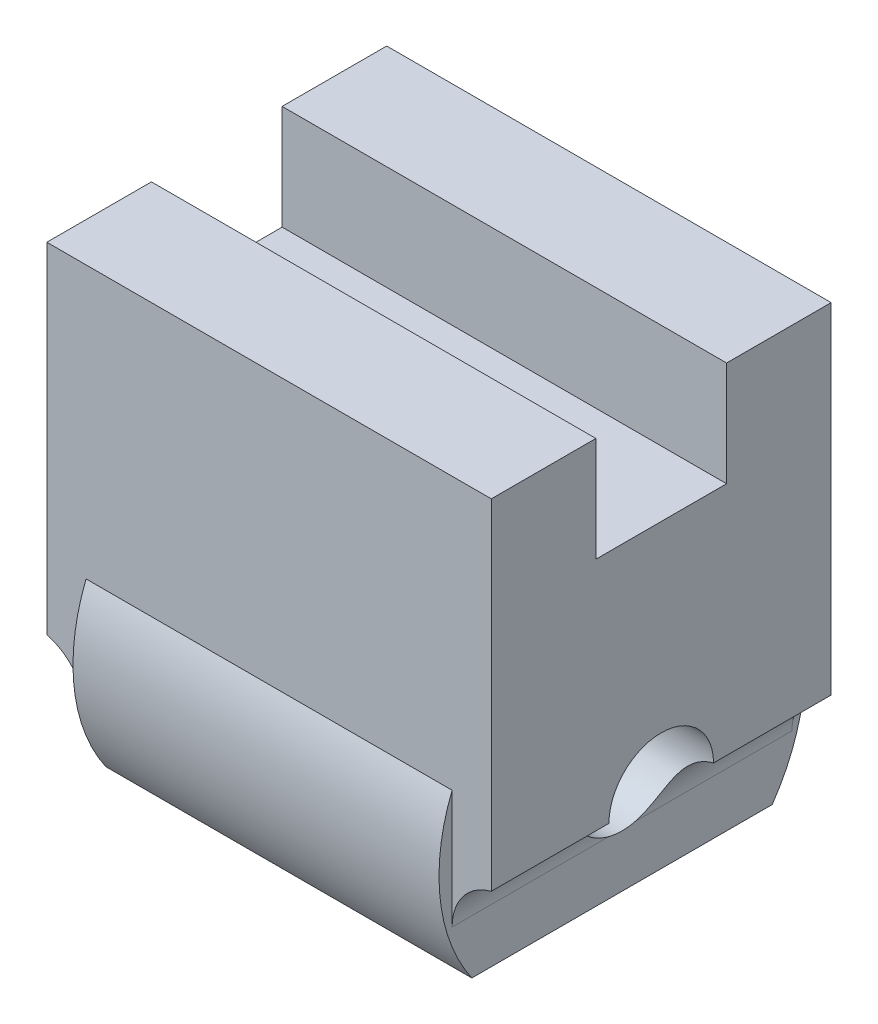
ISO-10303-21;
HEADER;
FILE_DESCRIPTION(('STEP AP214'),'2;1');
FILE_NAME('part.step','',(''),(''),'','','');
FILE_SCHEMA(('AUTOMOTIVE_DESIGN { 1 0 10303 214 1 1 1 1 }'));
ENDSEC;
DATA;
#1=APPLICATION_CONTEXT('core data for automotive mechanical design processes');
#2=APPLICATION_PROTOCOL_DEFINITION('international standard','automotive_design',2000,#1);
#3=PRODUCT_CONTEXT('',#1,'mechanical');
#4=PRODUCT('Part','Part','',(#3));
#5=PRODUCT_RELATED_PRODUCT_CATEGORY('part','',(#4));
#6=PRODUCT_DEFINITION_FORMATION('','',#4);
#7=PRODUCT_DEFINITION_CONTEXT('part definition',#1,'design');
#8=PRODUCT_DEFINITION('design','',#6,#7);
#9=PRODUCT_DEFINITION_SHAPE('','',#8);
#10=(LENGTH_UNIT() NAMED_UNIT(*) SI_UNIT(.MILLI.,.METRE.));
#11=(NAMED_UNIT(*) PLANE_ANGLE_UNIT() SI_UNIT($,.RADIAN.));
#12=(NAMED_UNIT(*) SI_UNIT($,.STERADIAN.) SOLID_ANGLE_UNIT());
#13=UNCERTAINTY_MEASURE_WITH_UNIT(LENGTH_MEASURE(1.E-05),#10,'distance_accuracy_value','');
#14=(GEOMETRIC_REPRESENTATION_CONTEXT(3) GLOBAL_UNCERTAINTY_ASSIGNED_CONTEXT((#13)) GLOBAL_UNIT_ASSIGNED_CONTEXT((#10,
#11,#12)) REPRESENTATION_CONTEXT('',''));
#15=CARTESIAN_POINT('',(0.,0.,0.));
#16=DIRECTION('',(0.,0.,1.));
#17=DIRECTION('',(1.,0.,0.));
#18=AXIS2_PLACEMENT_3D('',#15,#16,#17);
#19=CARTESIAN_POINT('',(70.,70.,0.));
#20=DIRECTION('',(-1.,0.,0.));
#21=DIRECTION('',(0.,0.,1.));
#22=AXIS2_PLACEMENT_3D('',#19,#20,#21);
#23=CYLINDRICAL_SURFACE('',#22,70.);
#24=CARTESIAN_POINT('',(70.,70.,0.));
#25=DIRECTION('',(1.,0.,0.));
#26=DIRECTION('',(0.,0.,-1.));
#27=AXIS2_PLACEMENT_3D('',#24,#25,#26);
#28=CIRCLE('',#27,70.);
#29=CARTESIAN_POINT('',(70.,30.,-57.4456264653803));
#30=VERTEX_POINT('',#29);
#31=CARTESIAN_POINT('',(70.,95.9807621135332,-65.));
#32=VERTEX_POINT('',#31);
#33=EDGE_CURVE('E174',#30,#32,#28,.T.);
#34=ORIENTED_EDGE('',*,*,#33,.F.);
#35=DIRECTION('',(-1.,0.,0.));
#36=VECTOR('',#35,1.);
#37=CARTESIAN_POINT('',(70.,30.,-57.4456264653803));
#38=LINE('',#37,#36);
#39=CARTESIAN_POINT('',(-70.,30.,-57.4456264653803));
#40=VERTEX_POINT('',#39);
#41=EDGE_CURVE('E11',#30,#40,#38,.T.);
#42=ORIENTED_EDGE('',*,*,#41,.T.);
#43=CARTESIAN_POINT('',(-70.,70.,0.));
#44=DIRECTION('',(1.,0.,0.));
#45=DIRECTION('',(0.,0.,-1.));
#46=AXIS2_PLACEMENT_3D('',#43,#44,#45);
#47=CIRCLE('',#46,70.);
#48=CARTESIAN_POINT('',(-70.,95.9807621135332,-65.));
#49=VERTEX_POINT('',#48);
#50=EDGE_CURVE('E170',#40,#49,#47,.T.);
#51=ORIENTED_EDGE('',*,*,#50,.T.);
#52=DIRECTION('',(-1.,0.,0.));
#53=VECTOR('',#52,1.);
#54=CARTESIAN_POINT('',(70.,95.9807621135332,-65.));
#55=LINE('',#54,#53);
#56=EDGE_CURVE('E182',#49,#32,#55,.F.);
#57=ORIENTED_EDGE('',*,*,#56,.T.);
#58=EDGE_LOOP('',(#34,#42,#51,#57));
#59=FACE_BOUND('',#58,.T.);
#60=ADVANCED_FACE('F32',(#59),#23,.T.);
#61=CARTESIAN_POINT('',(1.3992221045877E-12,200.,0.));
#62=DIRECTION('',(0.,-1.,0.));
#63=DIRECTION('',(1.,0.,0.));
#64=AXIS2_PLACEMENT_3D('',#61,#62,#63);
#65=PLANE('',#64);
#66=DIRECTION('',(0.,0.,-1.));
#67=VECTOR('',#66,1.);
#68=CARTESIAN_POINT('',(-84.9999999999986,200.000000000001,65.));
#69=LINE('',#68,#67);
#70=CARTESIAN_POINT('',(-84.9999999999995,200.000000000001,-25.));
#71=VERTEX_POINT('',#70);
#72=CARTESIAN_POINT('',(-84.9999999999986,200.000000000001,-65.));
#73=VERTEX_POINT('',#72);
#74=EDGE_CURVE('E383',#71,#73,#69,.T.);
#75=ORIENTED_EDGE('',*,*,#74,.F.);
#76=DIRECTION('',(1.,0.,0.));
#77=VECTOR('',#76,1.);
#78=CARTESIAN_POINT('',(1.3992221045877E-12,200.,-25.));
#79=LINE('',#78,#77);
#80=CARTESIAN_POINT('',(85.0000000000014,199.999999999999,-25.));
#81=VERTEX_POINT('',#80);
#82=EDGE_CURVE('E188',#71,#81,#79,.T.);
#83=ORIENTED_EDGE('',*,*,#82,.T.);
#84=DIRECTION('',(0.,0.,1.));
#85=VECTOR('',#84,1.);
#86=CARTESIAN_POINT('',(85.0000000000014,199.999999999999,65.));
#87=LINE('',#86,#85);
#88=CARTESIAN_POINT('',(85.0000000000014,199.999999999999,-65.));
#89=VERTEX_POINT('',#88);
#90=EDGE_CURVE('E379',#89,#81,#87,.T.);
#91=ORIENTED_EDGE('',*,*,#90,.F.);
#92=DIRECTION('',(1.,0.,0.));
#93=VECTOR('',#92,1.);
#94=CARTESIAN_POINT('',(-84.9999999999986,200.000000000001,-65.));
#95=LINE('',#94,#93);
#96=EDGE_CURVE('E326',#73,#89,#95,.T.);
#97=ORIENTED_EDGE('',*,*,#96,.F.);
#98=EDGE_LOOP('',(#75,#83,#91,#97));
#99=FACE_BOUND('',#98,.T.);
#100=ADVANCED_FACE('F258',(#99),#65,.F.);
#101=CARTESIAN_POINT('',(70.,70.,0.));
#102=DIRECTION('',(1.,0.,0.));
#103=DIRECTION('',(0.,0.,-1.));
#104=AXIS2_PLACEMENT_3D('',#101,#102,#103);
#105=PLANE('',#104);
#106=DIRECTION('',(0.,0.,1.));
#107=VECTOR('',#106,1.);
#108=CARTESIAN_POINT('',(70.,30.,0.));
#109=LINE('',#108,#107);
#110=CARTESIAN_POINT('',(70.,30.,57.4456264653803));
#111=VERTEX_POINT('',#110);
#112=EDGE_CURVE('E48',#30,#111,#109,.T.);
#113=ORIENTED_EDGE('',*,*,#112,.F.);
#114=ORIENTED_EDGE('',*,*,#33,.T.);
#115=DIRECTION('',(0.,1.,0.));
#116=VECTOR('',#115,1.);
#117=CARTESIAN_POINT('',(70.,70.,-65.));
#118=LINE('',#117,#116);
#119=CARTESIAN_POINT('',(70.,50.6350832689622,-65.));
#120=VERTEX_POINT('',#119);
#121=EDGE_CURVE('E283',#120,#32,#118,.T.);
#122=ORIENTED_EDGE('',*,*,#121,.F.);
#123=DIRECTION('',(0.,0.,-1.));
#124=VECTOR('',#123,1.);
#125=CARTESIAN_POINT('',(70.,50.6350832689622,-20.));
#126=LINE('',#125,#124);
#127=CARTESIAN_POINT('',(70.,50.6350832689622,-4.99999999999721));
#128=VERTEX_POINT('',#127);
#129=EDGE_CURVE('E304',#120,#128,#126,.F.);
#130=ORIENTED_EDGE('',*,*,#129,.T.);
#131=CARTESIAN_POINT('',(70.,70.,0.));
#132=DIRECTION('',(1.,0.,0.));
#133=DIRECTION('',(0.,0.,-1.));
#134=AXIS2_PLACEMENT_3D('',#131,#132,#133);
#135=CIRCLE('',#134,20.);
#136=CARTESIAN_POINT('',(70.,50.6350832689622,4.99999999999721));
#137=VERTEX_POINT('',#136);
#138=EDGE_CURVE('E178',#137,#128,#135,.T.);
#139=ORIENTED_EDGE('',*,*,#138,.F.);
#140=DIRECTION('',(0.,0.,-1.));
#141=VECTOR('',#140,1.);
#142=CARTESIAN_POINT('',(70.,50.6350832689622,65.));
#143=LINE('',#142,#141);
#144=CARTESIAN_POINT('',(70.,50.6350832689622,65.));
#145=VERTEX_POINT('',#144);
#146=EDGE_CURVE('E240',#137,#145,#143,.F.);
#147=ORIENTED_EDGE('',*,*,#146,.T.);
#148=DIRECTION('',(0.,-1.,0.));
#149=VECTOR('',#148,1.);
#150=CARTESIAN_POINT('',(70.,70.,65.));
#151=LINE('',#150,#149);
#152=CARTESIAN_POINT('',(70.,95.9807621135331,65.));
#153=VERTEX_POINT('',#152);
#154=EDGE_CURVE('E56',#153,#145,#151,.T.);
#155=ORIENTED_EDGE('',*,*,#154,.F.);
#156=EDGE_CURVE('E176',#153,#111,#28,.T.);
#157=ORIENTED_EDGE('',*,*,#156,.T.);
#158=EDGE_LOOP('',(#113,#114,#122,#130,#139,#147,#155,#157));
#159=FACE_BOUND('',#158,.T.);
#160=ADVANCED_FACE('F225',(#159),#105,.T.);
#161=CARTESIAN_POINT('',(-70.,70.,0.));
#162=DIRECTION('',(1.,0.,0.));
#163=DIRECTION('',(0.,0.,-1.));
#164=AXIS2_PLACEMENT_3D('',#161,#162,#163);
#165=PLANE('',#164);
#166=ORIENTED_EDGE('',*,*,#50,.F.);
#167=DIRECTION('',(0.,0.,1.));
#168=VECTOR('',#167,1.);
#169=CARTESIAN_POINT('',(-70.,30.,0.));
#170=LINE('',#169,#168);
#171=CARTESIAN_POINT('',(-70.,30.,57.4456264653803));
#172=VERTEX_POINT('',#171);
#173=EDGE_CURVE('E157',#40,#172,#170,.T.);
#174=ORIENTED_EDGE('',*,*,#173,.T.);
#175=CARTESIAN_POINT('',(-70.,95.9807621135331,65.));
#176=VERTEX_POINT('',#175);
#177=EDGE_CURVE('E167',#176,#172,#47,.T.);
#178=ORIENTED_EDGE('',*,*,#177,.F.);
#179=DIRECTION('',(0.,-1.,0.));
#180=VECTOR('',#179,1.);
#181=CARTESIAN_POINT('',(-70.,70.,65.));
#182=LINE('',#181,#180);
#183=CARTESIAN_POINT('',(-70.,50.6350832689636,65.));
#184=VERTEX_POINT('',#183);
#185=EDGE_CURVE('E341',#176,#184,#182,.T.);
#186=ORIENTED_EDGE('',*,*,#185,.T.);
#187=DIRECTION('',(0.,0.,-1.));
#188=VECTOR('',#187,1.);
#189=CARTESIAN_POINT('',(-70.,50.6350832689636,0.));
#190=LINE('',#189,#188);
#191=CARTESIAN_POINT('',(-70.,50.6350832689636,5.0000000000028));
#192=VERTEX_POINT('',#191);
#193=EDGE_CURVE('E191',#184,#192,#190,.T.);
#194=ORIENTED_EDGE('',*,*,#193,.T.);
#195=CARTESIAN_POINT('',(-70.,70.,0.));
#196=DIRECTION('',(1.,0.,0.));
#197=DIRECTION('',(0.,0.,-1.));
#198=AXIS2_PLACEMENT_3D('',#195,#196,#197);
#199=CIRCLE('',#198,20.);
#200=CARTESIAN_POINT('',(-70.,50.6350832689636,-5.0000000000028));
#201=VERTEX_POINT('',#200);
#202=EDGE_CURVE('E288',#192,#201,#199,.T.);
#203=ORIENTED_EDGE('',*,*,#202,.T.);
#204=DIRECTION('',(0.,0.,-1.));
#205=VECTOR('',#204,1.);
#206=CARTESIAN_POINT('',(-70.,50.6350832689636,0.));
#207=LINE('',#206,#205);
#208=CARTESIAN_POINT('',(-70.,50.6350832689636,-65.));
#209=VERTEX_POINT('',#208);
#210=EDGE_CURVE('E194',#201,#209,#207,.T.);
#211=ORIENTED_EDGE('',*,*,#210,.T.);
#212=DIRECTION('',(0.,1.,0.));
#213=VECTOR('',#212,1.);
#214=CARTESIAN_POINT('',(-70.,70.,-65.));
#215=LINE('',#214,#213);
#216=EDGE_CURVE('E289',#209,#49,#215,.T.);
#217=ORIENTED_EDGE('',*,*,#216,.T.);
#218=EDGE_LOOP('',(#166,#174,#178,#186,#194,#203,#211,#217));
#219=FACE_BOUND('',#218,.T.);
#220=ADVANCED_FACE('F166',(#219),#165,.F.);
#221=ORIENTED_EDGE('',*,*,#177,.T.);
#222=DIRECTION('',(-1.,0.,0.));
#223=VECTOR('',#222,1.);
#224=CARTESIAN_POINT('',(70.,30.,57.4456264653803));
#225=LINE('',#224,#223);
#226=EDGE_CURVE('E41',#172,#111,#225,.F.);
#227=ORIENTED_EDGE('',*,*,#226,.T.);
#228=ORIENTED_EDGE('',*,*,#156,.F.);
#229=DIRECTION('',(-1.,0.,0.));
#230=VECTOR('',#229,1.);
#231=CARTESIAN_POINT('',(70.,95.9807621135331,65.));
#232=LINE('',#231,#230);
#233=EDGE_CURVE('E173',#153,#176,#232,.T.);
#234=ORIENTED_EDGE('',*,*,#233,.T.);
#235=EDGE_LOOP('',(#221,#227,#228,#234));
#236=FACE_BOUND('',#235,.T.);
#237=ADVANCED_FACE('F172',(#236),#23,.T.);
#238=CARTESIAN_POINT('',(70.,70.,0.));
#239=DIRECTION('',(-1.,0.,0.));
#240=DIRECTION('',(0.,0.,1.));
#241=AXIS2_PLACEMENT_3D('',#238,#239,#240);
#242=CYLINDRICAL_SURFACE('',#241,20.);
#243=CARTESIAN_POINT('',(85.0000000000014,70.,0.));
#244=DIRECTION('',(1.,0.,0.));
#245=DIRECTION('',(0.,0.,-1.));
#246=AXIS2_PLACEMENT_3D('',#243,#244,#245);
#247=CIRCLE('',#246,20.);
#248=CARTESIAN_POINT('',(85.0000000000014,69.9999999999994,-20.));
#249=VERTEX_POINT('',#248);
#250=CARTESIAN_POINT('',(85.0000000000014,69.9999999999994,20.));
#251=VERTEX_POINT('',#250);
#252=EDGE_CURVE('E277',#249,#251,#247,.T.);
#253=ORIENTED_EDGE('',*,*,#252,.T.);
#254=CARTESIAN_POINT('',(85.0000000000014,69.9999999999994,20.));
#255=CARTESIAN_POINT('',(84.7427074592039,69.9335671294805,19.9999941252534));
#256=CARTESIAN_POINT('',(84.4867666335434,69.8620132510583,19.9996696078788));
#257=CARTESIAN_POINT('',(83.9779374257079,69.7087661743903,19.9980274471001));
#258=CARTESIAN_POINT('',(83.7250490956175,69.6270728034024,19.9967097867744));
#259=CARTESIAN_POINT('',(82.9714623482678,69.3669283434809,19.9907330250322));
#260=CARTESIAN_POINT('',(82.4758803123705,69.173422758553,19.9840500385));
#261=CARTESIAN_POINT('',(81.4993489290365,68.7465286444309,19.9618308336082));
#262=CARTESIAN_POINT('',(81.0184900783613,68.5129360333819,19.9462483130445));
#263=CARTESIAN_POINT('',(80.0774660251078,68.0082889903879,19.9021911135866));
#264=CARTESIAN_POINT('',(79.6172989777623,67.7372379068456,19.8737175864989));
#265=CARTESIAN_POINT('',(78.7195029979795,67.1588985733926,19.7993284013292));
#266=CARTESIAN_POINT('',(78.2819573440731,66.8514884714401,19.7533528766909));
#267=CARTESIAN_POINT('',(77.4346109814203,66.2041298660986,19.6392297160765));
#268=CARTESIAN_POINT('',(77.0248112102497,65.864180264086,19.5710813312969));
#269=CARTESIAN_POINT('',(76.2376187549375,65.1566560348378,19.4080749020957));
#270=CARTESIAN_POINT('',(75.8601349964767,64.7891649117772,19.3132953765189));
#271=CARTESIAN_POINT('',(75.1395414964075,64.030615716364,19.0924684475093));
#272=CARTESIAN_POINT('',(74.7964268403537,63.6395610262148,18.966425523422));
#273=CARTESIAN_POINT('',(74.1756360546293,62.8747952871399,18.6917580273858));
#274=CARTESIAN_POINT('',(73.8948626715499,62.5025454159218,18.5460610080773));
#275=CARTESIAN_POINT('',(73.3657431761455,61.7487453449488,18.2231945912555));
#276=CARTESIAN_POINT('',(73.1173951251092,61.3671957028477,18.0460270768603));
#277=CARTESIAN_POINT('',(72.6538479711963,60.6006084014706,17.6588733036046));
#278=CARTESIAN_POINT('',(72.4386495919481,60.2155706662467,17.4488863285255));
#279=CARTESIAN_POINT('',(72.0412033464985,59.4480499452908,16.9957311522824));
#280=CARTESIAN_POINT('',(71.8589533982601,59.0655667996043,16.7525650494383));
#281=CARTESIAN_POINT('',(71.5443117110312,58.3502179838621,16.2619118927584));
#282=CARTESIAN_POINT('',(71.40865294179,58.0164809935816,16.0177724685596));
#283=CARTESIAN_POINT('',(71.1610867512103,57.3595571358377,15.5046084980192));
#284=CARTESIAN_POINT('',(71.0491773131202,57.036369374526,15.2355860674868));
#285=CARTESIAN_POINT('',(70.8471686439326,56.4039059793817,14.6739613503173));
#286=CARTESIAN_POINT('',(70.7570731910547,56.0946327631138,14.3813549905844));
#287=CARTESIAN_POINT('',(70.5964515323665,55.4929922170986,13.7742296372979));
#288=CARTESIAN_POINT('',(70.5259262547055,55.2006256897005,13.4597096053353));
#289=CARTESIAN_POINT('',(70.3988962246105,54.6211904914265,12.7943887496277));
#290=CARTESIAN_POINT('',(70.3432643680769,54.335110355471,12.4425612193168));
#291=CARTESIAN_POINT('',(70.2479012824552,53.7866089425579,11.7188795384661));
#292=CARTESIAN_POINT('',(70.2081712269359,53.5241894128833,11.3470239121298));
#293=CARTESIAN_POINT('',(70.1416844650012,53.024808090428,10.5853820661507));
#294=CARTESIAN_POINT('',(70.1149311364398,52.7878529385296,10.1955912068281));
#295=CARTESIAN_POINT('',(70.0716186272242,52.3409636582875,9.40034123010729));
#296=CARTESIAN_POINT('',(70.055057913984,52.131025471365,8.99488447801873));
#297=CARTESIAN_POINT('',(70.0334006331355,51.798540063703,8.29507635327198));
#298=CARTESIAN_POINT('',(70.0263518584067,51.668759856237,8.00419074375462));
#299=CARTESIAN_POINT('',(70.0151577328729,51.4232311126667,7.41653781772456));
#300=CARTESIAN_POINT('',(70.011011975328,51.307480612749,7.1197713311716));
#301=CARTESIAN_POINT('',(70.0048917123063,51.0905342956625,6.52173583528294));
#302=CARTESIAN_POINT('',(70.0029121425622,50.9893050137183,6.22047900390617));
#303=CARTESIAN_POINT('',(70.0004736473763,50.8012956691385,5.61344696504418));
#304=CARTESIAN_POINT('',(70.0000148893766,50.7145171985427,5.30767126375185));
#305=CARTESIAN_POINT('',(70.,50.6350832689622,4.99999999999721));
#306=B_SPLINE_CURVE_WITH_KNOTS('',3,(#254,#255,#256,#257,#258,#259,#260,#261,#262,#263,#264,
#265,#266,#267,#268,#269,#270,#271,#272,#273,#274,#275,#276,#277,#278,#279,#280,#281,#282,#283,
#284,#285,#286,#287,#288,#289,#290,#291,#292,#293,#294,#295,#296,#297,#298,#299,#300,#301,#302,
#303,#304,#305),.UNSPECIFIED.,.F.,.F.,(4,2,2,2,2,2,2,2,2,2,2,2,2,2,2,2,2,2,2,2,2,2,2,2,2,4),(0.,
0.797081363371371,1.59417630812601,3.18848402512487,4.79116311684559,6.39369903807382,
8.00176650623362,9.60988828636525,11.2133175794024,12.8165172694632,14.2799171292234,
15.7432294521723,17.2065737134291,18.6698254724797,19.9738998315775,21.277863406616,
22.5820526690735,23.8863037743872,25.2554922205815,26.6247816956151,27.9944274069276,
29.3638671246942,30.3193238214475,31.2746466229725,32.2277311997555,33.1809207080943),.UNSPECIFIED.);
#307=EDGE_CURVE('E232',#251,#137,#306,.T.);
#308=ORIENTED_EDGE('',*,*,#307,.T.);
#309=ORIENTED_EDGE('',*,*,#138,.T.);
#310=CARTESIAN_POINT('',(70.,50.6350832689622,-4.99999999999721));
#311=CARTESIAN_POINT('',(70.0000058747466,50.7015161394813,-5.2572925407947));
#312=CARTESIAN_POINT('',(70.0003303921212,50.7730700179035,-5.51323336645523));
#313=CARTESIAN_POINT('',(70.0019725528999,50.9263170945715,-6.0220625742907));
#314=CARTESIAN_POINT('',(70.0032902132256,51.0080104655593,-6.27495090438108));
#315=CARTESIAN_POINT('',(70.0092669749678,51.2681549254808,-7.02853765173086));
#316=CARTESIAN_POINT('',(70.0159499615,51.4616605104087,-7.52411968762812));
#317=CARTESIAN_POINT('',(70.0381691663917,51.8885546245307,-8.50065107096221));
#318=CARTESIAN_POINT('',(70.0537516869555,52.1221472355797,-8.98150992163746));
#319=CARTESIAN_POINT('',(70.0978088864133,52.6267942785736,-9.92253397489101));
#320=CARTESIAN_POINT('',(70.126282413501,52.8978453621158,-10.3827010222365));
#321=CARTESIAN_POINT('',(70.2006715986707,53.4761846955688,-11.2804970020194));
#322=CARTESIAN_POINT('',(70.246647123309,53.7835947975213,-11.7180426559258));
#323=CARTESIAN_POINT('',(70.3607702839233,54.4309534028628,-12.5653890185787));
#324=CARTESIAN_POINT('',(70.4289186687029,54.7709030048754,-12.9751887897493));
#325=CARTESIAN_POINT('',(70.5919250979041,55.4784272341235,-13.7623812450616));
#326=CARTESIAN_POINT('',(70.6867046234808,55.8459183571841,-14.1398650035224));
#327=CARTESIAN_POINT('',(70.9075315524905,56.6044675525973,-14.8604585035917));
#328=CARTESIAN_POINT('',(71.0335744765777,56.9955222427464,-15.2035731596455));
#329=CARTESIAN_POINT('',(71.3082419726139,57.7602879818214,-15.8243639453699));
#330=CARTESIAN_POINT('',(71.4539389919223,58.1325378530395,-16.1051373284494));
#331=CARTESIAN_POINT('',(71.7768054087441,58.8863379240124,-16.6342568238539));
#332=CARTESIAN_POINT('',(71.9539729231393,59.2678875661136,-16.8826048748902));
#333=CARTESIAN_POINT('',(72.3411266963949,60.0344748674907,-17.3461520288032));
#334=CARTESIAN_POINT('',(72.551113671474,60.4195126027146,-17.5613504080514));
#335=CARTESIAN_POINT('',(73.0042688477171,61.1870333236705,-17.9587966535011));
#336=CARTESIAN_POINT('',(73.2474349505611,61.5695164693571,-18.1410466017396));
#337=CARTESIAN_POINT('',(73.738088107241,62.2848652850993,-18.4556882889685));
#338=CARTESIAN_POINT('',(73.9822275314398,62.6186022753798,-18.5913470582097));
#339=CARTESIAN_POINT('',(74.4953915019802,63.2755261331238,-18.8389132487894));
#340=CARTESIAN_POINT('',(74.7644139325125,63.5987138944355,-18.9508226868796));
#341=CARTESIAN_POINT('',(75.3260386496821,64.2311772895798,-19.1528313560672));
#342=CARTESIAN_POINT('',(75.6186450094149,64.5404505058477,-19.2429268089451));
#343=CARTESIAN_POINT('',(76.2257703627014,65.1420910518629,-19.4035484676333));
#344=CARTESIAN_POINT('',(76.540290394664,65.434457579261,-19.4740737452944));
#345=CARTESIAN_POINT('',(77.2056112503715,66.0138927775351,-19.6011037753894));
#346=CARTESIAN_POINT('',(77.5574387806824,66.2999729134906,-19.656735631923));
#347=CARTESIAN_POINT('',(78.281120461533,66.8484743264037,-19.7520987175447));
#348=CARTESIAN_POINT('',(78.6529760878693,67.1108938560783,-19.7918287730641));
#349=CARTESIAN_POINT('',(79.4146179338484,67.6102751785336,-19.8583155349987));
#350=CARTESIAN_POINT('',(79.8044087931709,67.8472303304321,-19.8850688635602));
#351=CARTESIAN_POINT('',(80.5996587698917,68.2941196106741,-19.9283813727758));
#352=CARTESIAN_POINT('',(81.0051155219803,68.5040577975967,-19.9449420860159));
#353=CARTESIAN_POINT('',(81.7049236467269,68.8365432052587,-19.9665993668645));
#354=CARTESIAN_POINT('',(81.9958092562443,68.9663234127247,-19.9736481415933));
#355=CARTESIAN_POINT('',(82.5834621822742,69.211852156295,-19.9848422671271));
#356=CARTESIAN_POINT('',(82.8802286688272,69.3276026562127,-19.988988024672));
#357=CARTESIAN_POINT('',(83.4782641647157,69.5445489732992,-19.9951082876937));
#358=CARTESIAN_POINT('',(83.7795209960925,69.6457782552435,-19.9970878574378));
#359=CARTESIAN_POINT('',(84.3865530349544,69.8337875998233,-19.9995263526237));
#360=CARTESIAN_POINT('',(84.6923287362467,69.9205660704191,-19.9999851106234));
#361=CARTESIAN_POINT('',(85.0000000000013,69.9999999999996,-20.));
#362=B_SPLINE_CURVE_WITH_KNOTS('',3,(#310,#311,#312,#313,#314,#315,#316,#317,#318,#319,#320,
#321,#322,#323,#324,#325,#326,#327,#328,#329,#330,#331,#332,#333,#334,#335,#336,#337,#338,#339,
#340,#341,#342,#343,#344,#345,#346,#347,#348,#349,#350,#351,#352,#353,#354,#355,#356,#357,#358,
#359,#360,#361),.UNSPECIFIED.,.F.,.F.,(4,2,2,2,2,2,2,2,2,2,2,2,2,2,2,2,2,2,2,2,2,2,2,2,2,4),(0.,
0.797081363371389,1.59417630812604,3.18848402512492,4.79116311684566,6.39369903807395,
8.00176650623378,9.60988828636545,11.2133175794026,12.8165172694634,14.2799171292237,
15.7432294521726,17.2065737134295,18.6698254724801,19.973899831578,21.2778634066165,
22.5820526690739,23.8863037743877,25.255492220582,26.6247816956155,27.994427406928,
29.3638671246946,30.3193238214478,31.2746466229727,32.2277311997555,33.1809207080942),.UNSPECIFIED.);
#363=EDGE_CURVE('E162',#128,#249,#362,.T.);
#364=ORIENTED_EDGE('',*,*,#363,.T.);
#365=EDGE_LOOP('',(#253,#308,#309,#364));
#366=FACE_BOUND('',#365,.T.);
#367=ORIENTED_EDGE('',*,*,#202,.F.);
#368=CARTESIAN_POINT('',(-70.,50.6350832689636,5.0000000000028));
#369=CARTESIAN_POINT('',(-70.0000058747466,50.7015161394828,5.25729254080025));
#370=CARTESIAN_POINT('',(-70.0003303921212,50.7730700179051,5.51323336646074));
#371=CARTESIAN_POINT('',(-70.0019725528999,50.9263170945732,6.02206257429613));
#372=CARTESIAN_POINT('',(-70.0032902132256,51.0080104655611,6.27495090438646));
#373=CARTESIAN_POINT('',(-70.0092669749678,51.2681549254827,7.02853765173611));
#374=CARTESIAN_POINT('',(-70.0159499615,51.4616605104108,7.52411968763328));
#375=CARTESIAN_POINT('',(-70.0381691663918,51.888554624533,8.50065107096718));
#376=CARTESIAN_POINT('',(-70.0537516869556,52.1221472355821,8.98150992164232));
#377=CARTESIAN_POINT('',(-70.0978088864134,52.6267942785763,9.92253397489566));
#378=CARTESIAN_POINT('',(-70.1262824135011,52.8978453621186,10.382701022241));
#379=CARTESIAN_POINT('',(-70.2006715986709,53.4761846955718,11.2804970020237));
#380=CARTESIAN_POINT('',(-70.2466471233092,53.7835947975243,11.71804265593));
#381=CARTESIAN_POINT('',(-70.3607702839236,54.430953402866,12.5653890185826));
#382=CARTESIAN_POINT('',(-70.4289186687033,54.7709030048786,12.9751887897531));
#383=CARTESIAN_POINT('',(-70.5919250979046,55.4784272341269,13.7623812450652));
#384=CARTESIAN_POINT('',(-70.6867046234814,55.8459183571875,14.1398650035259));
#385=CARTESIAN_POINT('',(-70.9075315524911,56.6044675526008,14.8604585035949));
#386=CARTESIAN_POINT('',(-71.0335744765784,56.99552224275,15.2035731596486));
#387=CARTESIAN_POINT('',(-71.3082419726147,57.760287981825,15.8243639453728));
#388=CARTESIAN_POINT('',(-71.4539389919232,58.1325378530432,16.1051373284521));
#389=CARTESIAN_POINT('',(-71.776805408745,58.8863379240161,16.6342568238564));
#390=CARTESIAN_POINT('',(-71.9539729231404,59.2678875661172,16.8826048748926));
#391=CARTESIAN_POINT('',(-72.3411266963961,60.0344748674943,17.3461520288053));
#392=CARTESIAN_POINT('',(-72.5511136714752,60.4195126027182,17.5613504080533));
#393=CARTESIAN_POINT('',(-73.0042688477184,61.187033323674,17.9587966535028));
#394=CARTESIAN_POINT('',(-73.2474349505625,61.5695164693606,18.1410466017412));
#395=CARTESIAN_POINT('',(-73.7380881072424,62.2848652851027,18.4556882889699));
#396=CARTESIAN_POINT('',(-73.9822275314413,62.6186022753832,18.591347058211));
#397=CARTESIAN_POINT('',(-74.4953915019817,63.2755261331271,18.8389132487906));
#398=CARTESIAN_POINT('',(-74.7644139325141,63.5987138944388,18.9508226868807));
#399=CARTESIAN_POINT('',(-75.3260386496837,64.231177289583,19.1528313560682));
#400=CARTESIAN_POINT('',(-75.6186450094166,64.5404505058509,19.242926808946));
#401=CARTESIAN_POINT('',(-76.2257703627032,65.142091051866,19.4035484676341));
#402=CARTESIAN_POINT('',(-76.5402903946658,65.4344575792641,19.4740737452951));
#403=CARTESIAN_POINT('',(-77.2056112503734,66.0138927775381,19.60110377539));
#404=CARTESIAN_POINT('',(-77.5574387806843,66.2999729134936,19.6567356319236));
#405=CARTESIAN_POINT('',(-78.2811204615351,66.8484743264067,19.7520987175451));
#406=CARTESIAN_POINT('',(-78.6529760878715,67.1108938560812,19.7918287730645));
#407=CARTESIAN_POINT('',(-79.4146179338507,67.6102751785365,19.8583155349991));
#408=CARTESIAN_POINT('',(-79.8044087931733,67.8472303304349,19.8850688635605));
#409=CARTESIAN_POINT('',(-80.5996587698942,68.2941196106769,19.928381372776));
#410=CARTESIAN_POINT('',(-81.0051155219828,68.5040577975995,19.9449420860161));
#411=CARTESIAN_POINT('',(-81.7049236467292,68.8365432052612,19.9665993668647));
#412=CARTESIAN_POINT('',(-81.9958092562462,68.966323412727,19.9736481415934));
#413=CARTESIAN_POINT('',(-82.5834621822756,69.211852156297,19.9848422671271));
#414=CARTESIAN_POINT('',(-82.8802286688282,69.3276026562145,19.9889880246721));
#415=CARTESIAN_POINT('',(-83.478264164716,69.5445489733008,19.9951082876937));
#416=CARTESIAN_POINT('',(-83.7795209960924,69.6457782552449,19.9970878574378));
#417=CARTESIAN_POINT('',(-84.3865530349536,69.8337875998245,19.9995263526237));
#418=CARTESIAN_POINT('',(-84.6923287362455,69.9205660704202,19.9999851106234));
#419=CARTESIAN_POINT('',(-84.9999999999998,70.0000000000007,20.));
#420=B_SPLINE_CURVE_WITH_KNOTS('',3,(#368,#369,#370,#371,#372,#373,#374,#375,#376,#377,#378,
#379,#380,#381,#382,#383,#384,#385,#386,#387,#388,#389,#390,#391,#392,#393,#394,#395,#396,#397,
#398,#399,#400,#401,#402,#403,#404,#405,#406,#407,#408,#409,#410,#411,#412,#413,#414,#415,#416,
#417,#418,#419),.UNSPECIFIED.,.F.,.F.,(4,2,2,2,2,2,2,2,2,2,2,2,2,2,2,2,2,2,2,2,2,2,2,2,2,4),(0.,
0.797081363371327,1.59417630812592,3.18848402512467,4.79116311684529,6.39369903807346,
8.00176650623316,9.60988828636471,11.2133175794017,12.8165172694625,14.2799171292225,
15.7432294521713,17.2065737134281,18.6698254724785,19.9738998315764,21.2778634066148,
22.5820526690722,23.8863037743859,25.2554922205804,26.624781695614,27.9944274069265,
29.3638671246932,30.3193238214454,31.2746466229691,32.2277311997508,33.1809207080884),.UNSPECIFIED.);
#421=CARTESIAN_POINT('',(-84.9999999999998,70.0000000000006,20.));
#422=VERTEX_POINT('',#421);
#423=EDGE_CURVE('E207',#192,#422,#420,.T.);
#424=ORIENTED_EDGE('',*,*,#423,.T.);
#425=CARTESIAN_POINT('',(-84.9999999999998,70.,0.));
#426=DIRECTION('',(1.,0.,0.));
#427=DIRECTION('',(0.,0.,-1.));
#428=AXIS2_PLACEMENT_3D('',#425,#426,#427);
#429=CIRCLE('',#428,20.);
#430=CARTESIAN_POINT('',(-84.9999999999998,70.0000000000006,-20.));
#431=VERTEX_POINT('',#430);
#432=EDGE_CURVE('E352',#431,#422,#429,.T.);
#433=ORIENTED_EDGE('',*,*,#432,.F.);
#434=CARTESIAN_POINT('',(-84.9999999999998,70.0000000000006,-20.));
#435=CARTESIAN_POINT('',(-84.7427074592024,69.9335671294815,-19.9999941252534));
#436=CARTESIAN_POINT('',(-84.4867666335418,69.8620132510593,-19.9996696078788));
#437=CARTESIAN_POINT('',(-83.9779374257064,69.7087661743912,-19.9980274471001));
#438=CARTESIAN_POINT('',(-83.725049095616,69.6270728034034,-19.9967097867744));
#439=CARTESIAN_POINT('',(-82.9714623482663,69.3669283434818,-19.9907330250322));
#440=CARTESIAN_POINT('',(-82.4758803123691,69.1734227585538,-19.9840500385));
#441=CARTESIAN_POINT('',(-81.4993489290351,68.7465286444317,-19.9618308336083));
#442=CARTESIAN_POINT('',(-81.0184900783599,68.5129360333826,-19.9462483130445));
#443=CARTESIAN_POINT('',(-80.0774660251064,68.0082889903886,-19.9021911135867));
#444=CARTESIAN_POINT('',(-79.617298977761,67.7372379068463,-19.873717586499));
#445=CARTESIAN_POINT('',(-78.7195029979782,67.1588985733932,-19.7993284013293));
#446=CARTESIAN_POINT('',(-78.2819573440719,66.8514884714407,-19.753352876691));
#447=CARTESIAN_POINT('',(-77.4346109814191,66.2041298660991,-19.6392297160766));
#448=CARTESIAN_POINT('',(-77.0248112102486,65.8641802640864,-19.571081331297));
#449=CARTESIAN_POINT('',(-76.2376187549364,65.1566560348382,-19.4080749020958));
#450=CARTESIAN_POINT('',(-75.8601349964756,64.7891649117776,-19.313295376519));
#451=CARTESIAN_POINT('',(-75.1395414964065,64.0306157163644,-19.0924684475094));
#452=CARTESIAN_POINT('',(-74.7964268403527,63.6395610262152,-18.9664255234221));
#453=CARTESIAN_POINT('',(-74.1756360546285,62.8747952871402,-18.6917580273859));
#454=CARTESIAN_POINT('',(-73.8948626715491,62.5025454159221,-18.5460610080774));
#455=CARTESIAN_POINT('',(-73.3657431761447,61.7487453449491,-18.2231945912557));
#456=CARTESIAN_POINT('',(-73.1173951251084,61.367195702848,-18.0460270768604));
#457=CARTESIAN_POINT('',(-72.6538479711956,60.6006084014708,-17.6588733036047));
#458=CARTESIAN_POINT('',(-72.4386495919475,60.215570666247,-17.4488863285257));
#459=CARTESIAN_POINT('',(-72.0412033464979,59.4480499452911,-16.9957311522825));
#460=CARTESIAN_POINT('',(-71.8589533982595,59.0655667996045,-16.7525650494385));
#461=CARTESIAN_POINT('',(-71.5443117110306,58.3502179838623,-16.2619118927586));
#462=CARTESIAN_POINT('',(-71.4086529417895,58.0164809935818,-16.0177724685598));
#463=CARTESIAN_POINT('',(-71.1610867512098,57.3595571358379,-15.5046084980194));
#464=CARTESIAN_POINT('',(-71.0491773131197,57.0363693745262,-15.235586067487));
#465=CARTESIAN_POINT('',(-70.8471686439322,56.4039059793819,-14.6739613503174));
#466=CARTESIAN_POINT('',(-70.7570731910543,56.094632763114,-14.3813549905845));
#467=CARTESIAN_POINT('',(-70.5964515323662,55.4929922170988,-13.774229637298));
#468=CARTESIAN_POINT('',(-70.5259262547052,55.2006256897007,-13.4597096053355));
#469=CARTESIAN_POINT('',(-70.3988962246102,54.6211904914266,-12.7943887496279));
#470=CARTESIAN_POINT('',(-70.3432643680766,54.3351103554711,-12.442561219317));
#471=CARTESIAN_POINT('',(-70.247901282455,53.786608942558,-11.7188795384663));
#472=CARTESIAN_POINT('',(-70.2081712269357,53.5241894128834,-11.34702391213));
#473=CARTESIAN_POINT('',(-70.141684465001,53.0248080904281,-10.5853820661509));
#474=CARTESIAN_POINT('',(-70.1149311364396,52.7878529385297,-10.1955912068283));
#475=CARTESIAN_POINT('',(-70.071618627224,52.3409636582876,-9.40034123010746));
#476=CARTESIAN_POINT('',(-70.0550579139839,52.131025471365,-8.9948844780189));
#477=CARTESIAN_POINT('',(-70.0334006331354,51.7985400637033,-8.29507635327257));
#478=CARTESIAN_POINT('',(-70.0263518584067,51.6687598562375,-8.00419074375564));
#479=CARTESIAN_POINT('',(-70.0151577328729,51.4232311126675,-7.41653781772646));
#480=CARTESIAN_POINT('',(-70.011011975328,51.3074806127499,-7.11977133117395));
#481=CARTESIAN_POINT('',(-70.0048917123063,51.0905342956636,-6.5217358352862));
#482=CARTESIAN_POINT('',(-70.0029121425622,50.9893050137195,-6.22047900390989));
#483=CARTESIAN_POINT('',(-70.0004736473764,50.8012956691399,-5.61344696504883));
#484=CARTESIAN_POINT('',(-70.0000148893766,50.7145171985441,-5.30767126375697));
#485=CARTESIAN_POINT('',(-70.,50.6350832689636,-5.0000000000028));
#486=B_SPLINE_CURVE_WITH_KNOTS('',3,(#434,#435,#436,#437,#438,#439,#440,#441,#442,#443,#444,
#445,#446,#447,#448,#449,#450,#451,#452,#453,#454,#455,#456,#457,#458,#459,#460,#461,#462,#463,
#464,#465,#466,#467,#468,#469,#470,#471,#472,#473,#474,#475,#476,#477,#478,#479,#480,#481,#482,
#483,#484,#485),.UNSPECIFIED.,.F.,.F.,(4,2,2,2,2,2,2,2,2,2,2,2,2,2,2,2,2,2,2,2,2,2,2,2,2,4),(0.,
0.79708136337136,1.59417630812598,3.18848402512483,4.79116311684552,6.39369903807376,
8.00176650623356,9.60988828636519,11.2133175794022,12.8165172694631,14.2799171292232,
15.7432294521721,17.2065737134289,18.6698254724794,19.9738998315773,21.2778634066157,
22.5820526690732,23.8863037743869,25.2554922205813,26.6247816956149,27.9944274069273,
29.363867124694,30.3193238214459,31.2746466229695,32.227731199751,33.1809207080884),.UNSPECIFIED.);
#487=EDGE_CURVE('E199',#431,#201,#486,.T.);
#488=ORIENTED_EDGE('',*,*,#487,.T.);
#489=EDGE_LOOP('',(#367,#424,#433,#488));
#490=FACE_BOUND('',#489,.T.);
#491=ADVANCED_FACE('F217',(#366,#490),#242,.F.);
#492=CARTESIAN_POINT('',(85.0000000000014,199.999999999999,65.));
#493=DIRECTION('',(1.,0.,0.));
#494=DIRECTION('',(0.,1.,0.));
#495=AXIS2_PLACEMENT_3D('',#492,#493,#494);
#496=PLANE('',#495);
#497=ORIENTED_EDGE('',*,*,#252,.F.);
#498=DIRECTION('',(0.,0.,1.));
#499=VECTOR('',#498,1.);
#500=CARTESIAN_POINT('',(85.0000000000005,69.9999999999994,65.));
#501=LINE('',#500,#499);
#502=CARTESIAN_POINT('',(85.0000000000005,69.9999999999994,-65.));
#503=VERTEX_POINT('',#502);
#504=EDGE_CURVE('E306',#503,#249,#501,.T.);
#505=ORIENTED_EDGE('',*,*,#504,.F.);
#506=DIRECTION('',(0.,-1.,0.));
#507=VECTOR('',#506,1.);
#508=CARTESIAN_POINT('',(85.0000000000014,199.999999999999,-65.));
#509=LINE('',#508,#507);
#510=EDGE_CURVE('E339',#89,#503,#509,.T.);
#511=ORIENTED_EDGE('',*,*,#510,.F.);
#512=ORIENTED_EDGE('',*,*,#90,.T.);
#513=DIRECTION('',(0.,1.,0.));
#514=VECTOR('',#513,1.);
#515=CARTESIAN_POINT('',(85.0000000000014,199.999999999999,-25.));
#516=LINE('',#515,#514);
#517=CARTESIAN_POINT('',(85.0000000000011,159.999999999999,-25.));
#518=VERTEX_POINT('',#517);
#519=EDGE_CURVE('E331',#518,#81,#516,.T.);
#520=ORIENTED_EDGE('',*,*,#519,.F.);
#521=DIRECTION('',(0.,0.,-1.));
#522=VECTOR('',#521,1.);
#523=CARTESIAN_POINT('',(85.0000000000011,159.999999999999,65.));
#524=LINE('',#523,#522);
#525=CARTESIAN_POINT('',(85.0000000000012,159.999999999999,25.));
#526=VERTEX_POINT('',#525);
#527=EDGE_CURVE('E328',#526,#518,#524,.T.);
#528=ORIENTED_EDGE('',*,*,#527,.F.);
#529=DIRECTION('',(0.,-1.,0.));
#530=VECTOR('',#529,1.);
#531=CARTESIAN_POINT('',(85.0000000000014,199.999999999999,25.));
#532=LINE('',#531,#530);
#533=CARTESIAN_POINT('',(85.0000000000014,199.999999999999,25.));
#534=VERTEX_POINT('',#533);
#535=EDGE_CURVE('E374',#534,#526,#532,.T.);
#536=ORIENTED_EDGE('',*,*,#535,.F.);
#537=CARTESIAN_POINT('',(85.0000000000014,199.999999999999,65.));
#538=VERTEX_POINT('',#537);
#539=EDGE_CURVE('E324',#534,#538,#87,.T.);
#540=ORIENTED_EDGE('',*,*,#539,.T.);
#541=DIRECTION('',(0.,-1.,0.));
#542=VECTOR('',#541,1.);
#543=CARTESIAN_POINT('',(85.0000000000014,199.999999999999,65.));
#544=LINE('',#543,#542);
#545=CARTESIAN_POINT('',(85.0000000000005,69.9999999999994,65.));
#546=VERTEX_POINT('',#545);
#547=EDGE_CURVE('E316',#538,#546,#544,.T.);
#548=ORIENTED_EDGE('',*,*,#547,.T.);
#549=EDGE_CURVE('E321',#251,#546,#501,.T.);
#550=ORIENTED_EDGE('',*,*,#549,.F.);
#551=EDGE_LOOP('',(#497,#505,#511,#512,#520,#528,#536,#540,#548,#550));
#552=FACE_BOUND('',#551,.T.);
#553=ADVANCED_FACE('F222',(#552),#496,.T.);
#554=CARTESIAN_POINT('',(-84.9999999999986,200.000000000001,-65.));
#555=DIRECTION('',(0.,0.,-1.));
#556=DIRECTION('',(-1.,0.,0.));
#557=AXIS2_PLACEMENT_3D('',#554,#555,#556);
#558=PLANE('',#557);
#559=ORIENTED_EDGE('',*,*,#510,.T.);
#560=CARTESIAN_POINT('',(90.,50.6350832689622,-65.));
#561=DIRECTION('',(0.,0.,-1.));
#562=DIRECTION('',(-1.,0.,0.));
#563=AXIS2_PLACEMENT_3D('',#560,#561,#562);
#564=CIRCLE('',#563,20.);
#565=EDGE_CURVE('E286',#503,#120,#564,.F.);
#566=ORIENTED_EDGE('',*,*,#565,.T.);
#567=ORIENTED_EDGE('',*,*,#121,.T.);
#568=ORIENTED_EDGE('',*,*,#56,.F.);
#569=ORIENTED_EDGE('',*,*,#216,.F.);
#570=CARTESIAN_POINT('',(-90.,50.6350832689636,-65.));
#571=DIRECTION('',(0.,0.,-1.));
#572=DIRECTION('',(-1.,0.,0.));
#573=AXIS2_PLACEMENT_3D('',#570,#571,#572);
#574=CIRCLE('',#573,20.);
#575=CARTESIAN_POINT('',(-84.9999999999995,70.0000000000006,-65.));
#576=VERTEX_POINT('',#575);
#577=EDGE_CURVE('E197',#209,#576,#574,.F.);
#578=ORIENTED_EDGE('',*,*,#577,.T.);
#579=DIRECTION('',(0.,-1.,0.));
#580=VECTOR('',#579,1.);
#581=CARTESIAN_POINT('',(-84.9999999999986,200.000000000001,-65.));
#582=LINE('',#581,#580);
#583=EDGE_CURVE('E342',#73,#576,#582,.T.);
#584=ORIENTED_EDGE('',*,*,#583,.F.);
#585=ORIENTED_EDGE('',*,*,#96,.T.);
#586=EDGE_LOOP('',(#559,#566,#567,#568,#569,#578,#584,#585));
#587=FACE_BOUND('',#586,.T.);
#588=ADVANCED_FACE('F285',(#587),#558,.T.);
#589=CARTESIAN_POINT('',(-84.9999999999986,200.000000000001,65.));
#590=DIRECTION('',(-1.,0.,0.));
#591=DIRECTION('',(0.,-1.,0.));
#592=AXIS2_PLACEMENT_3D('',#589,#590,#591);
#593=PLANE('',#592);
#594=ORIENTED_EDGE('',*,*,#432,.T.);
#595=DIRECTION('',(0.,0.,-1.));
#596=VECTOR('',#595,1.);
#597=CARTESIAN_POINT('',(-84.9999999999995,70.0000000000006,65.));
#598=LINE('',#597,#596);
#599=CARTESIAN_POINT('',(-84.9999999999995,70.0000000000006,65.));
#600=VERTEX_POINT('',#599);
#601=EDGE_CURVE('E336',#600,#422,#598,.T.);
#602=ORIENTED_EDGE('',*,*,#601,.F.);
#603=DIRECTION('',(0.,-1.,0.));
#604=VECTOR('',#603,1.);
#605=CARTESIAN_POINT('',(-84.9999999999986,200.000000000001,65.));
#606=LINE('',#605,#604);
#607=CARTESIAN_POINT('',(-84.9999999999986,200.000000000001,65.));
#608=VERTEX_POINT('',#607);
#609=EDGE_CURVE('E325',#608,#600,#606,.T.);
#610=ORIENTED_EDGE('',*,*,#609,.F.);
#611=CARTESIAN_POINT('',(-84.9999999999986,200.000000000001,25.));
#612=VERTEX_POINT('',#611);
#613=EDGE_CURVE('E384',#608,#612,#69,.T.);
#614=ORIENTED_EDGE('',*,*,#613,.T.);
#615=DIRECTION('',(0.,-1.,0.));
#616=VECTOR('',#615,1.);
#617=CARTESIAN_POINT('',(-84.9999999999993,240.000000000001,25.));
#618=LINE('',#617,#616);
#619=CARTESIAN_POINT('',(-84.9999999999998,160.000000000001,25.));
#620=VERTEX_POINT('',#619);
#621=EDGE_CURVE('E361',#612,#620,#618,.T.);
#622=ORIENTED_EDGE('',*,*,#621,.T.);
#623=DIRECTION('',(0.,0.,-1.));
#624=VECTOR('',#623,1.);
#625=CARTESIAN_POINT('',(-84.9999999999998,160.000000000001,25.));
#626=LINE('',#625,#624);
#627=CARTESIAN_POINT('',(-84.9999999999998,160.000000000001,-25.));
#628=VERTEX_POINT('',#627);
#629=EDGE_CURVE('E367',#620,#628,#626,.T.);
#630=ORIENTED_EDGE('',*,*,#629,.T.);
#631=DIRECTION('',(0.,1.,0.));
#632=VECTOR('',#631,1.);
#633=CARTESIAN_POINT('',(-84.9999999999993,240.000000000001,-25.));
#634=LINE('',#633,#632);
#635=EDGE_CURVE('E358',#628,#71,#634,.T.);
#636=ORIENTED_EDGE('',*,*,#635,.T.);
#637=ORIENTED_EDGE('',*,*,#74,.T.);
#638=ORIENTED_EDGE('',*,*,#583,.T.);
#639=EDGE_CURVE('E330',#431,#576,#598,.T.);
#640=ORIENTED_EDGE('',*,*,#639,.F.);
#641=EDGE_LOOP('',(#594,#602,#610,#614,#622,#630,#636,#637,#638,#640));
#642=FACE_BOUND('',#641,.T.);
#643=ADVANCED_FACE('F355',(#642),#593,.T.);
#644=CARTESIAN_POINT('',(-84.9999999999986,200.000000000001,65.));
#645=DIRECTION('',(0.,0.,1.));
#646=DIRECTION('',(1.,0.,0.));
#647=AXIS2_PLACEMENT_3D('',#644,#645,#646);
#648=PLANE('',#647);
#649=ORIENTED_EDGE('',*,*,#233,.F.);
#650=ORIENTED_EDGE('',*,*,#154,.T.);
#651=CARTESIAN_POINT('',(90.,50.6350832689622,65.));
#652=DIRECTION('',(0.,0.,1.));
#653=DIRECTION('',(1.,0.,0.));
#654=AXIS2_PLACEMENT_3D('',#651,#652,#653);
#655=CIRCLE('',#654,20.);
#656=EDGE_CURVE('E239',#145,#546,#655,.F.);
#657=ORIENTED_EDGE('',*,*,#656,.T.);
#658=ORIENTED_EDGE('',*,*,#547,.F.);
#659=DIRECTION('',(-1.,0.,0.));
#660=VECTOR('',#659,1.);
#661=CARTESIAN_POINT('',(-84.9999999999986,200.000000000001,65.));
#662=LINE('',#661,#660);
#663=EDGE_CURVE('E382',#538,#608,#662,.T.);
#664=ORIENTED_EDGE('',*,*,#663,.T.);
#665=ORIENTED_EDGE('',*,*,#609,.T.);
#666=CARTESIAN_POINT('',(-90.,50.6350832689636,65.));
#667=DIRECTION('',(0.,0.,1.));
#668=DIRECTION('',(1.,0.,0.));
#669=AXIS2_PLACEMENT_3D('',#666,#667,#668);
#670=CIRCLE('',#669,20.);
#671=EDGE_CURVE('E349',#600,#184,#670,.F.);
#672=ORIENTED_EDGE('',*,*,#671,.T.);
#673=ORIENTED_EDGE('',*,*,#185,.F.);
#674=EDGE_LOOP('',(#649,#650,#657,#658,#664,#665,#672,#673));
#675=FACE_BOUND('',#674,.T.);
#676=ADVANCED_FACE('F314',(#675),#648,.T.);
#677=ORIENTED_EDGE('',*,*,#539,.F.);
#678=DIRECTION('',(-1.,0.,0.));
#679=VECTOR('',#678,1.);
#680=CARTESIAN_POINT('',(1.3992221045877E-12,200.,25.));
#681=LINE('',#680,#679);
#682=EDGE_CURVE('E185',#534,#612,#681,.T.);
#683=ORIENTED_EDGE('',*,*,#682,.T.);
#684=ORIENTED_EDGE('',*,*,#613,.F.);
#685=ORIENTED_EDGE('',*,*,#663,.F.);
#686=EDGE_LOOP('',(#677,#683,#684,#685));
#687=FACE_BOUND('',#686,.T.);
#688=ADVANCED_FACE('F265',(#687),#65,.F.);
#689=CARTESIAN_POINT('',(-84.9999999999993,240.000000000001,-25.));
#690=DIRECTION('',(0.,0.,-1.));
#691=DIRECTION('',(0.,1.,0.));
#692=AXIS2_PLACEMENT_3D('',#689,#690,#691);
#693=PLANE('',#692);
#694=ORIENTED_EDGE('',*,*,#519,.T.);
#695=ORIENTED_EDGE('',*,*,#82,.F.);
#696=ORIENTED_EDGE('',*,*,#635,.F.);
#697=DIRECTION('',(1.,0.,0.));
#698=VECTOR('',#697,1.);
#699=CARTESIAN_POINT('',(-84.9999999999998,160.000000000001,-25.));
#700=LINE('',#699,#698);
#701=EDGE_CURVE('E371',#628,#518,#700,.T.);
#702=ORIENTED_EDGE('',*,*,#701,.T.);
#703=EDGE_LOOP('',(#694,#695,#696,#702));
#704=FACE_BOUND('',#703,.T.);
#705=ADVANCED_FACE('F397',(#704),#693,.F.);
#706=CARTESIAN_POINT('',(-84.9999999999998,160.000000000001,25.));
#707=DIRECTION('',(0.,-1.,0.));
#708=DIRECTION('',(1.,0.,0.));
#709=AXIS2_PLACEMENT_3D('',#706,#707,#708);
#710=PLANE('',#709);
#711=ORIENTED_EDGE('',*,*,#527,.T.);
#712=ORIENTED_EDGE('',*,*,#701,.F.);
#713=ORIENTED_EDGE('',*,*,#629,.F.);
#714=DIRECTION('',(1.,0.,0.));
#715=VECTOR('',#714,1.);
#716=CARTESIAN_POINT('',(-84.9999999999998,160.000000000001,25.));
#717=LINE('',#716,#715);
#718=EDGE_CURVE('E370',#620,#526,#717,.T.);
#719=ORIENTED_EDGE('',*,*,#718,.T.);
#720=EDGE_LOOP('',(#711,#712,#713,#719));
#721=FACE_BOUND('',#720,.T.);
#722=ADVANCED_FACE('F400',(#721),#710,.F.);
#723=CARTESIAN_POINT('',(-84.9999999999993,240.000000000001,25.));
#724=DIRECTION('',(0.,0.,1.));
#725=DIRECTION('',(0.,-1.,0.));
#726=AXIS2_PLACEMENT_3D('',#723,#724,#725);
#727=PLANE('',#726);
#728=ORIENTED_EDGE('',*,*,#535,.T.);
#729=ORIENTED_EDGE('',*,*,#718,.F.);
#730=ORIENTED_EDGE('',*,*,#621,.F.);
#731=ORIENTED_EDGE('',*,*,#682,.F.);
#732=EDGE_LOOP('',(#728,#729,#730,#731));
#733=FACE_BOUND('',#732,.T.);
#734=ADVANCED_FACE('F254',(#733),#727,.F.);
#735=CARTESIAN_POINT('',(-90.,50.6350832689636,0.));
#736=DIRECTION('',(0.,0.,-1.));
#737=DIRECTION('',(0.,1.,0.));
#738=AXIS2_PLACEMENT_3D('',#735,#736,#737);
#739=CYLINDRICAL_SURFACE('',#738,20.);
#740=ORIENTED_EDGE('',*,*,#487,.F.);
#741=ORIENTED_EDGE('',*,*,#639,.T.);
#742=ORIENTED_EDGE('',*,*,#577,.F.);
#743=ORIENTED_EDGE('',*,*,#210,.F.);
#744=EDGE_LOOP('',(#740,#741,#742,#743));
#745=FACE_BOUND('',#744,.T.);
#746=ADVANCED_FACE('F214',(#745),#739,.F.);
#747=CARTESIAN_POINT('',(-90.,50.6350832689636,0.));
#748=DIRECTION('',(0.,0.,-1.));
#749=DIRECTION('',(0.,1.,0.));
#750=AXIS2_PLACEMENT_3D('',#747,#748,#749);
#751=CYLINDRICAL_SURFACE('',#750,20.);
#752=ORIENTED_EDGE('',*,*,#671,.F.);
#753=ORIENTED_EDGE('',*,*,#601,.T.);
#754=ORIENTED_EDGE('',*,*,#423,.F.);
#755=ORIENTED_EDGE('',*,*,#193,.F.);
#756=EDGE_LOOP('',(#752,#753,#754,#755));
#757=FACE_BOUND('',#756,.T.);
#758=ADVANCED_FACE('F246',(#757),#751,.F.);
#759=CARTESIAN_POINT('',(90.,50.6350832689622,0.));
#760=DIRECTION('',(0.,0.,1.));
#761=DIRECTION('',(1.,0.,0.));
#762=AXIS2_PLACEMENT_3D('',#759,#760,#761);
#763=CYLINDRICAL_SURFACE('',#762,20.);
#764=ORIENTED_EDGE('',*,*,#656,.F.);
#765=ORIENTED_EDGE('',*,*,#146,.F.);
#766=ORIENTED_EDGE('',*,*,#307,.F.);
#767=ORIENTED_EDGE('',*,*,#549,.T.);
#768=EDGE_LOOP('',(#764,#765,#766,#767));
#769=FACE_BOUND('',#768,.T.);
#770=ADVANCED_FACE('F243',(#769),#763,.F.);
#771=CARTESIAN_POINT('',(90.,50.6350832689622,0.));
#772=DIRECTION('',(0.,0.,1.));
#773=DIRECTION('',(1.,0.,0.));
#774=AXIS2_PLACEMENT_3D('',#771,#772,#773);
#775=CYLINDRICAL_SURFACE('',#774,20.);
#776=ORIENTED_EDGE('',*,*,#363,.F.);
#777=ORIENTED_EDGE('',*,*,#129,.F.);
#778=ORIENTED_EDGE('',*,*,#565,.F.);
#779=ORIENTED_EDGE('',*,*,#504,.T.);
#780=EDGE_LOOP('',(#776,#777,#778,#779));
#781=FACE_BOUND('',#780,.T.);
#782=ADVANCED_FACE('F34',(#781),#775,.F.);
#783=CARTESIAN_POINT('',(-86.2140476728677,30.,-80.7147744692094));
#784=DIRECTION('',(0.,1.,0.));
#785=DIRECTION('',(0.,0.,1.));
#786=AXIS2_PLACEMENT_3D('',#783,#784,#785);
#787=PLANE('',#786);
#788=ORIENTED_EDGE('',*,*,#112,.T.);
#789=ORIENTED_EDGE('',*,*,#226,.F.);
#790=ORIENTED_EDGE('',*,*,#173,.F.);
#791=ORIENTED_EDGE('',*,*,#41,.F.);
#792=EDGE_LOOP('',(#788,#789,#790,#791));
#793=FACE_BOUND('',#792,.T.);
#794=ADVANCED_FACE('F156',(#793),#787,.F.);
#795=CLOSED_SHELL('',(#60,#100,#160,#220,#237,#491,#553,#588,#643,#676,#688,#705,#722,#734,#746,
#758,#770,#782,#794));
#796=MANIFOLD_SOLID_BREP('B2',#795);
#797=ADVANCED_BREP_SHAPE_REPRESENTATION('',(#18,#796),#14);
#798=SHAPE_DEFINITION_REPRESENTATION(#9,#797);
ENDSEC;
END-ISO-10303-21;
